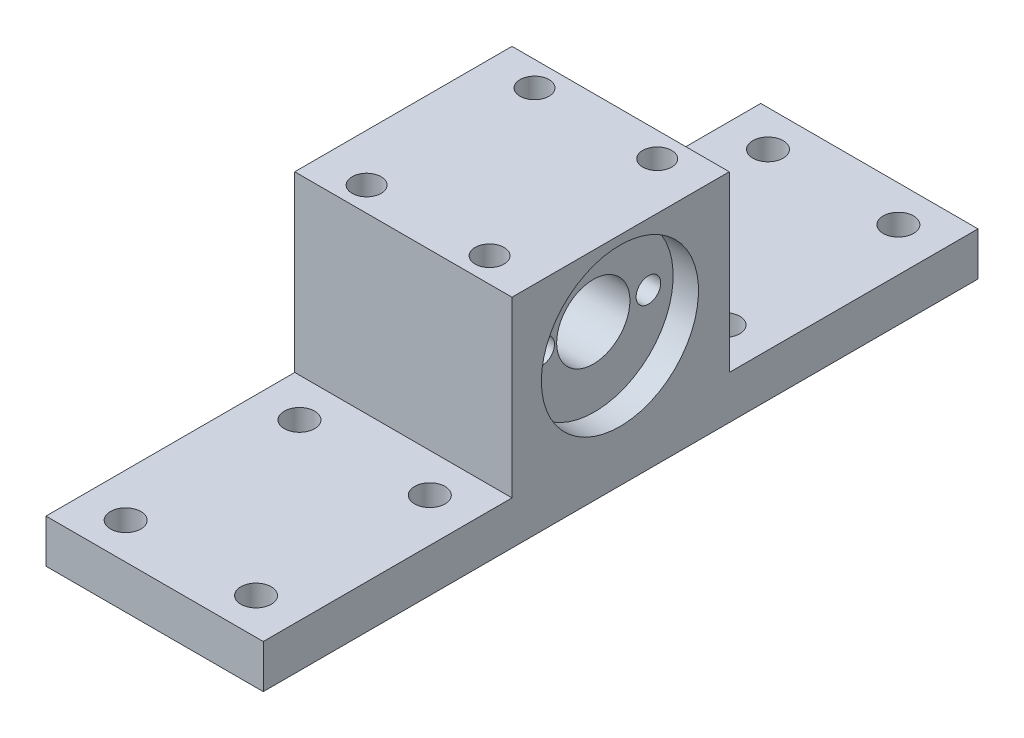
ISO-10303-21;
HEADER;
FILE_DESCRIPTION(('STEP AP214'),'2;1');
FILE_NAME('part.step','',(''),(''),'','','');
FILE_SCHEMA(('AUTOMOTIVE_DESIGN { 1 0 10303 214 1 1 1 1 }'));
ENDSEC;
DATA;
#1=APPLICATION_CONTEXT('core data for automotive mechanical design processes');
#2=APPLICATION_PROTOCOL_DEFINITION('international standard','automotive_design',2000,#1);
#3=PRODUCT_CONTEXT('',#1,'mechanical');
#4=PRODUCT('Part','Part','',(#3));
#5=PRODUCT_RELATED_PRODUCT_CATEGORY('part','',(#4));
#6=PRODUCT_DEFINITION_FORMATION('','',#4);
#7=PRODUCT_DEFINITION_CONTEXT('part definition',#1,'design');
#8=PRODUCT_DEFINITION('design','',#6,#7);
#9=PRODUCT_DEFINITION_SHAPE('','',#8);
#10=(LENGTH_UNIT() NAMED_UNIT(*) SI_UNIT(.MILLI.,.METRE.));
#11=(NAMED_UNIT(*) PLANE_ANGLE_UNIT() SI_UNIT($,.RADIAN.));
#12=(NAMED_UNIT(*) SI_UNIT($,.STERADIAN.) SOLID_ANGLE_UNIT());
#13=UNCERTAINTY_MEASURE_WITH_UNIT(LENGTH_MEASURE(1.E-05),#10,'distance_accuracy_value','');
#14=(GEOMETRIC_REPRESENTATION_CONTEXT(3) GLOBAL_UNCERTAINTY_ASSIGNED_CONTEXT((#13)) GLOBAL_UNIT_ASSIGNED_CONTEXT((#10,
#11,#12)) REPRESENTATION_CONTEXT('',''));
#15=CARTESIAN_POINT('',(0.,0.,0.));
#16=DIRECTION('',(0.,0.,1.));
#17=DIRECTION('',(1.,0.,0.));
#18=AXIS2_PLACEMENT_3D('',#15,#16,#17);
#19=CARTESIAN_POINT('',(30.,8.38775572035806,0.246661601781765));
#20=DIRECTION('',(-1.,0.,0.));
#21=DIRECTION('',(0.,0.,1.));
#22=AXIS2_PLACEMENT_3D('',#19,#20,#21);
#23=CYLINDRICAL_SURFACE('',#22,5.06);
#24=CARTESIAN_POINT('',(26.5,8.38775572035806,0.246661601781765));
#25=DIRECTION('',(1.,0.,0.));
#26=DIRECTION('',(0.,0.,-1.));
#27=AXIS2_PLACEMENT_3D('',#24,#25,#26);
#28=CIRCLE('',#27,5.06);
#29=CARTESIAN_POINT('',(26.5,8.38775572035806,-4.81333839821823));
#30=VERTEX_POINT('',#29);
#31=EDGE_CURVE('E195',#30,#30,#28,.T.);
#32=ORIENTED_EDGE('',*,*,#31,.T.);
#33=EDGE_LOOP('',(#32));
#34=FACE_BOUND('',#33,.T.);
#35=CARTESIAN_POINT('',(3.5,8.38775572035806,0.246661601781765));
#36=DIRECTION('',(-1.,0.,0.));
#37=DIRECTION('',(0.,0.,1.));
#38=AXIS2_PLACEMENT_3D('',#35,#36,#37);
#39=CIRCLE('',#38,5.06);
#40=CARTESIAN_POINT('',(3.5,8.38775572035806,5.30666160178176));
#41=VERTEX_POINT('',#40);
#42=EDGE_CURVE('E398',#41,#41,#39,.T.);
#43=ORIENTED_EDGE('',*,*,#42,.T.);
#44=EDGE_LOOP('',(#43));
#45=FACE_BOUND('',#44,.T.);
#46=ADVANCED_FACE('F43',(#34,#45),#23,.F.);
#47=CARTESIAN_POINT('',(30.,8.38775572035806,7.30666160178176));
#48=DIRECTION('',(-1.,0.,0.));
#49=DIRECTION('',(0.,0.,1.));
#50=AXIS2_PLACEMENT_3D('',#47,#48,#49);
#51=CYLINDRICAL_SURFACE('',#50,1.7);
#52=CARTESIAN_POINT('',(26.5,8.38775572035806,7.30666160178176));
#53=DIRECTION('',(1.,0.,0.));
#54=DIRECTION('',(0.,0.,-1.));
#55=AXIS2_PLACEMENT_3D('',#52,#53,#54);
#56=CIRCLE('',#55,1.7);
#57=CARTESIAN_POINT('',(26.5,8.38775572035806,5.60666160178176));
#58=VERTEX_POINT('',#57);
#59=EDGE_CURVE('E191',#58,#58,#56,.T.);
#60=ORIENTED_EDGE('',*,*,#59,.T.);
#61=EDGE_LOOP('',(#60));
#62=FACE_BOUND('',#61,.T.);
#63=CARTESIAN_POINT('',(3.5,8.38775572035806,7.30666160178176));
#64=DIRECTION('',(-1.,0.,0.));
#65=DIRECTION('',(0.,0.,1.));
#66=AXIS2_PLACEMENT_3D('',#63,#64,#65);
#67=CIRCLE('',#66,1.7);
#68=CARTESIAN_POINT('',(3.5,8.38775572035806,9.00666160178177));
#69=VERTEX_POINT('',#68);
#70=EDGE_CURVE('E396',#69,#69,#67,.T.);
#71=ORIENTED_EDGE('',*,*,#70,.T.);
#72=EDGE_LOOP('',(#71));
#73=FACE_BOUND('',#72,.T.);
#74=ADVANCED_FACE('F45',(#62,#73),#51,.F.);
#75=CARTESIAN_POINT('',(30.,8.38775572035806,-7.3636048463425));
#76=DIRECTION('',(-1.,0.,0.));
#77=DIRECTION('',(0.,0.,1.));
#78=AXIS2_PLACEMENT_3D('',#75,#76,#77);
#79=CYLINDRICAL_SURFACE('',#78,1.7);
#80=CARTESIAN_POINT('',(26.5,8.38775572035806,-7.3636048463425));
#81=DIRECTION('',(1.,0.,0.));
#82=DIRECTION('',(0.,0.,-1.));
#83=AXIS2_PLACEMENT_3D('',#80,#81,#82);
#84=CIRCLE('',#83,1.7);
#85=CARTESIAN_POINT('',(26.5,8.38775572035806,-9.0636048463425));
#86=VERTEX_POINT('',#85);
#87=EDGE_CURVE('E188',#86,#86,#84,.F.);
#88=ORIENTED_EDGE('',*,*,#87,.F.);
#89=EDGE_LOOP('',(#88));
#90=FACE_BOUND('',#89,.T.);
#91=CARTESIAN_POINT('',(3.5,8.38775572035806,-7.3636048463425));
#92=DIRECTION('',(-1.,0.,0.));
#93=DIRECTION('',(0.,0.,1.));
#94=AXIS2_PLACEMENT_3D('',#91,#92,#93);
#95=CIRCLE('',#94,1.7);
#96=CARTESIAN_POINT('',(3.5,8.38775572035806,-5.6636048463425));
#97=VERTEX_POINT('',#96);
#98=EDGE_CURVE('E47',#97,#97,#95,.F.);
#99=ORIENTED_EDGE('',*,*,#98,.F.);
#100=EDGE_LOOP('',(#99));
#101=FACE_BOUND('',#100,.T.);
#102=ADVANCED_FACE('F270',(#90,#101),#79,.F.);
#103=CARTESIAN_POINT('',(30.,20.4377557203581,0.));
#104=DIRECTION('',(0.,1.,0.));
#105=DIRECTION('',(0.,0.,1.));
#106=AXIS2_PLACEMENT_3D('',#103,#104,#105);
#107=PLANE('',#106);
#108=CARTESIAN_POINT('',(6.55109209006945,20.4377557203581,11.5970108437514));
#109=DIRECTION('',(0.,1.,0.));
#110=DIRECTION('',(0.,0.,-1.));
#111=AXIS2_PLACEMENT_3D('',#108,#109,#110);
#112=CIRCLE('',#111,2.);
#113=CARTESIAN_POINT('',(6.55109209006945,20.4377557203581,9.59701084375135));
#114=VERTEX_POINT('',#113);
#115=EDGE_CURVE('E382',#114,#114,#112,.T.);
#116=ORIENTED_EDGE('',*,*,#115,.F.);
#117=EDGE_LOOP('',(#116));
#118=FACE_BOUND('',#117,.T.);
#119=CARTESIAN_POINT('',(23.4929257150994,20.4377557203581,11.5648533822731));
#120=DIRECTION('',(0.,1.,0.));
#121=DIRECTION('',(0.,0.,1.));
#122=AXIS2_PLACEMENT_3D('',#119,#120,#121);
#123=CIRCLE('',#122,2.);
#124=CARTESIAN_POINT('',(23.4929257150994,20.4377557203581,13.5648533822731));
#125=VERTEX_POINT('',#124);
#126=EDGE_CURVE('E374',#125,#125,#123,.T.);
#127=ORIENTED_EDGE('',*,*,#126,.F.);
#128=EDGE_LOOP('',(#127));
#129=FACE_BOUND('',#128,.T.);
#130=CARTESIAN_POINT('',(23.4709320720999,20.4377557203581,-11.6094246229313));
#131=DIRECTION('',(0.,1.,0.));
#132=DIRECTION('',(0.,0.,-1.));
#133=AXIS2_PLACEMENT_3D('',#130,#131,#132);
#134=CIRCLE('',#133,2.);
#135=CARTESIAN_POINT('',(23.4709320720999,20.4377557203581,-13.6094246229313));
#136=VERTEX_POINT('',#135);
#137=EDGE_CURVE('E367',#136,#136,#134,.T.);
#138=ORIENTED_EDGE('',*,*,#137,.F.);
#139=EDGE_LOOP('',(#138));
#140=FACE_BOUND('',#139,.T.);
#141=CARTESIAN_POINT('',(6.52906792790008,20.4377557203581,-11.6094246229313));
#142=DIRECTION('',(0.,1.,0.));
#143=DIRECTION('',(0.,0.,1.));
#144=AXIS2_PLACEMENT_3D('',#141,#142,#143);
#145=CIRCLE('',#144,2.);
#146=CARTESIAN_POINT('',(6.52906792790008,20.4377557203581,-9.60942462293129));
#147=VERTEX_POINT('',#146);
#148=EDGE_CURVE('E369',#147,#147,#145,.T.);
#149=ORIENTED_EDGE('',*,*,#148,.F.);
#150=EDGE_LOOP('',(#149));
#151=FACE_BOUND('',#150,.T.);
#152=DIRECTION('',(0.,0.,-1.));
#153=VECTOR('',#152,1.);
#154=CARTESIAN_POINT('',(0.,20.4377557203581,0.));
#155=LINE('',#154,#153);
#156=CARTESIAN_POINT('',(0.,20.4377557203581,14.9715283777196));
#157=VERTEX_POINT('',#156);
#158=CARTESIAN_POINT('',(0.,20.4377557203581,-15.0284716222804));
#159=VERTEX_POINT('',#158);
#160=EDGE_CURVE('E141',#157,#159,#155,.T.);
#161=ORIENTED_EDGE('',*,*,#160,.F.);
#162=DIRECTION('',(-1.,0.,0.));
#163=VECTOR('',#162,1.);
#164=CARTESIAN_POINT('',(30.,20.4377557203581,14.9715283777196));
#165=LINE('',#164,#163);
#166=CARTESIAN_POINT('',(30.,20.4377557203581,14.9715283777196));
#167=VERTEX_POINT('',#166);
#168=EDGE_CURVE('E11',#167,#157,#165,.T.);
#169=ORIENTED_EDGE('',*,*,#168,.F.);
#170=DIRECTION('',(0.,0.,-1.));
#171=VECTOR('',#170,1.);
#172=CARTESIAN_POINT('',(30.,20.4377557203581,0.));
#173=LINE('',#172,#171);
#174=CARTESIAN_POINT('',(30.,20.4377557203581,-15.0284716222804));
#175=VERTEX_POINT('',#174);
#176=EDGE_CURVE('E162',#167,#175,#173,.T.);
#177=ORIENTED_EDGE('',*,*,#176,.T.);
#178=DIRECTION('',(-1.,0.,0.));
#179=VECTOR('',#178,1.);
#180=CARTESIAN_POINT('',(30.,20.4377557203581,-15.0284716222804));
#181=LINE('',#180,#179);
#182=EDGE_CURVE('E62',#175,#159,#181,.T.);
#183=ORIENTED_EDGE('',*,*,#182,.T.);
#184=EDGE_LOOP('',(#161,#169,#177,#183));
#185=FACE_BOUND('',#184,.T.);
#186=ADVANCED_FACE('F275',(#118,#129,#140,#151,#185),#107,.T.);
#187=CARTESIAN_POINT('',(30.,0.,14.9715283777196));
#188=DIRECTION('',(0.,0.,-1.));
#189=DIRECTION('',(0.,1.,0.));
#190=AXIS2_PLACEMENT_3D('',#187,#188,#189);
#191=PLANE('',#190);
#192=DIRECTION('',(0.,-1.,0.));
#193=VECTOR('',#192,1.);
#194=CARTESIAN_POINT('',(0.,0.,14.9715283777196));
#195=LINE('',#194,#193);
#196=CARTESIAN_POINT('',(0.,-3.56224427964192,14.9715283777196));
#197=VERTEX_POINT('',#196);
#198=EDGE_CURVE('E143',#157,#197,#195,.T.);
#199=ORIENTED_EDGE('',*,*,#198,.T.);
#200=DIRECTION('',(-1.,0.,0.));
#201=VECTOR('',#200,1.);
#202=CARTESIAN_POINT('',(30.,-3.56224427964192,14.9715283777196));
#203=LINE('',#202,#201);
#204=CARTESIAN_POINT('',(30.,-3.56224427964192,14.9715283777196));
#205=VERTEX_POINT('',#204);
#206=EDGE_CURVE('E53',#205,#197,#203,.T.);
#207=ORIENTED_EDGE('',*,*,#206,.F.);
#208=DIRECTION('',(0.,-1.,0.));
#209=VECTOR('',#208,1.);
#210=CARTESIAN_POINT('',(30.,0.,14.9715283777196));
#211=LINE('',#210,#209);
#212=EDGE_CURVE('E238',#167,#205,#211,.T.);
#213=ORIENTED_EDGE('',*,*,#212,.F.);
#214=ORIENTED_EDGE('',*,*,#168,.T.);
#215=EDGE_LOOP('',(#199,#207,#213,#214));
#216=FACE_BOUND('',#215,.T.);
#217=ADVANCED_FACE('F421',(#216),#191,.F.);
#218=CARTESIAN_POINT('',(30.,-3.56224427964192,0.));
#219=DIRECTION('',(0.,1.,0.));
#220=DIRECTION('',(0.,0.,1.));
#221=AXIS2_PLACEMENT_3D('',#218,#219,#220);
#222=PLANE('',#221);
#223=CARTESIAN_POINT('',(24.,-3.56224427964192,20.3185283777196));
#224=DIRECTION('',(0.,1.,0.));
#225=DIRECTION('',(0.,0.,1.));
#226=AXIS2_PLACEMENT_3D('',#223,#224,#225);
#227=CIRCLE('',#226,2.1);
#228=CARTESIAN_POINT('',(24.,-3.56224427964192,22.4185283777196));
#229=VERTEX_POINT('',#228);
#230=EDGE_CURVE('E144',#229,#229,#227,.T.);
#231=ORIENTED_EDGE('',*,*,#230,.F.);
#232=EDGE_LOOP('',(#231));
#233=FACE_BOUND('',#232,.T.);
#234=CARTESIAN_POINT('',(24.,-3.56224427964192,44.3185283777196));
#235=DIRECTION('',(0.,1.,0.));
#236=DIRECTION('',(0.,0.,1.));
#237=AXIS2_PLACEMENT_3D('',#234,#235,#236);
#238=CIRCLE('',#237,2.1);
#239=CARTESIAN_POINT('',(24.,-3.56224427964192,46.4185283777196));
#240=VERTEX_POINT('',#239);
#241=EDGE_CURVE('E232',#240,#240,#238,.T.);
#242=ORIENTED_EDGE('',*,*,#241,.F.);
#243=EDGE_LOOP('',(#242));
#244=FACE_BOUND('',#243,.T.);
#245=CARTESIAN_POINT('',(5.99999999999998,-3.56224427964192,44.3185283777196));
#246=DIRECTION('',(0.,1.,0.));
#247=DIRECTION('',(0.,0.,1.));
#248=AXIS2_PLACEMENT_3D('',#245,#246,#247);
#249=CIRCLE('',#248,2.1);
#250=CARTESIAN_POINT('',(5.99999999999998,-3.56224427964192,46.4185283777196));
#251=VERTEX_POINT('',#250);
#252=EDGE_CURVE('E229',#251,#251,#249,.T.);
#253=ORIENTED_EDGE('',*,*,#252,.F.);
#254=EDGE_LOOP('',(#253));
#255=FACE_BOUND('',#254,.T.);
#256=CARTESIAN_POINT('',(5.99999999999997,-3.56224427964192,20.3185283777196));
#257=DIRECTION('',(0.,1.,0.));
#258=DIRECTION('',(0.,0.,1.));
#259=AXIS2_PLACEMENT_3D('',#256,#257,#258);
#260=CIRCLE('',#259,2.1);
#261=CARTESIAN_POINT('',(5.99999999999997,-3.56224427964192,22.4185283777196));
#262=VERTEX_POINT('',#261);
#263=EDGE_CURVE('E185',#262,#262,#260,.T.);
#264=ORIENTED_EDGE('',*,*,#263,.F.);
#265=EDGE_LOOP('',(#264));
#266=FACE_BOUND('',#265,.T.);
#267=DIRECTION('',(0.,0.,-1.));
#268=VECTOR('',#267,1.);
#269=CARTESIAN_POINT('',(0.,-3.56224427964192,0.));
#270=LINE('',#269,#268);
#271=CARTESIAN_POINT('',(0.,-3.56224427964192,49.3185283777196));
#272=VERTEX_POINT('',#271);
#273=EDGE_CURVE('E147',#272,#197,#270,.T.);
#274=ORIENTED_EDGE('',*,*,#273,.F.);
#275=DIRECTION('',(-1.,0.,0.));
#276=VECTOR('',#275,1.);
#277=CARTESIAN_POINT('',(30.,-3.56224427964192,49.3185283777196));
#278=LINE('',#277,#276);
#279=CARTESIAN_POINT('',(30.,-3.56224427964192,49.3185283777196));
#280=VERTEX_POINT('',#279);
#281=EDGE_CURVE('E169',#280,#272,#278,.T.);
#282=ORIENTED_EDGE('',*,*,#281,.F.);
#283=DIRECTION('',(0.,0.,-1.));
#284=VECTOR('',#283,1.);
#285=CARTESIAN_POINT('',(30.,-3.56224427964192,0.));
#286=LINE('',#285,#284);
#287=EDGE_CURVE('E240',#280,#205,#286,.T.);
#288=ORIENTED_EDGE('',*,*,#287,.T.);
#289=ORIENTED_EDGE('',*,*,#206,.T.);
#290=EDGE_LOOP('',(#274,#282,#288,#289));
#291=FACE_BOUND('',#290,.T.);
#292=ADVANCED_FACE('F426',(#233,#244,#255,#266,#291),#222,.T.);
#293=CARTESIAN_POINT('',(30.,0.,49.3185283777196));
#294=DIRECTION('',(0.,0.,-1.));
#295=DIRECTION('',(-1.,0.,0.));
#296=AXIS2_PLACEMENT_3D('',#293,#294,#295);
#297=PLANE('',#296);
#298=DIRECTION('',(0.,-1.,0.));
#299=VECTOR('',#298,1.);
#300=CARTESIAN_POINT('',(0.,0.,49.3185283777196));
#301=LINE('',#300,#299);
#302=CARTESIAN_POINT('',(0.,-9.56224427964194,49.3185283777196));
#303=VERTEX_POINT('',#302);
#304=EDGE_CURVE('E150',#272,#303,#301,.T.);
#305=ORIENTED_EDGE('',*,*,#304,.T.);
#306=DIRECTION('',(-1.,0.,0.));
#307=VECTOR('',#306,1.);
#308=CARTESIAN_POINT('',(30.,-9.56224427964194,49.3185283777196));
#309=LINE('',#308,#307);
#310=CARTESIAN_POINT('',(30.,-9.56224427964194,49.3185283777196));
#311=VERTEX_POINT('',#310);
#312=EDGE_CURVE('E166',#311,#303,#309,.T.);
#313=ORIENTED_EDGE('',*,*,#312,.F.);
#314=DIRECTION('',(0.,-1.,0.));
#315=VECTOR('',#314,1.);
#316=CARTESIAN_POINT('',(30.,0.,49.3185283777196));
#317=LINE('',#316,#315);
#318=EDGE_CURVE('E136',#280,#311,#317,.T.);
#319=ORIENTED_EDGE('',*,*,#318,.F.);
#320=ORIENTED_EDGE('',*,*,#281,.T.);
#321=EDGE_LOOP('',(#305,#313,#319,#320));
#322=FACE_BOUND('',#321,.T.);
#323=ADVANCED_FACE('F246',(#322),#297,.F.);
#324=CARTESIAN_POINT('',(30.,-9.56224427964193,0.));
#325=DIRECTION('',(0.,1.,0.));
#326=DIRECTION('',(0.,0.,1.));
#327=AXIS2_PLACEMENT_3D('',#324,#325,#326);
#328=PLANE('',#327);
#329=CARTESIAN_POINT('',(24.,-9.56224427964194,20.3185283777196));
#330=DIRECTION('',(0.,1.,0.));
#331=DIRECTION('',(0.,0.,1.));
#332=AXIS2_PLACEMENT_3D('',#329,#330,#331);
#333=CIRCLE('',#332,2.1);
#334=CARTESIAN_POINT('',(24.,-9.56224427964194,22.4185283777196));
#335=VERTEX_POINT('',#334);
#336=EDGE_CURVE('E214',#335,#335,#333,.T.);
#337=ORIENTED_EDGE('',*,*,#336,.T.);
#338=EDGE_LOOP('',(#337));
#339=FACE_BOUND('',#338,.T.);
#340=CARTESIAN_POINT('',(24.,-9.56224427964194,44.3185283777196));
#341=DIRECTION('',(0.,1.,0.));
#342=DIRECTION('',(0.,0.,1.));
#343=AXIS2_PLACEMENT_3D('',#340,#341,#342);
#344=CIRCLE('',#343,2.1);
#345=CARTESIAN_POINT('',(24.,-9.56224427964194,46.4185283777196));
#346=VERTEX_POINT('',#345);
#347=EDGE_CURVE('E217',#346,#346,#344,.T.);
#348=ORIENTED_EDGE('',*,*,#347,.T.);
#349=EDGE_LOOP('',(#348));
#350=FACE_BOUND('',#349,.T.);
#351=CARTESIAN_POINT('',(5.99999999999998,-9.56224427964194,44.3185283777196));
#352=DIRECTION('',(0.,1.,0.));
#353=DIRECTION('',(0.,0.,1.));
#354=AXIS2_PLACEMENT_3D('',#351,#352,#353);
#355=CIRCLE('',#354,2.1);
#356=CARTESIAN_POINT('',(5.99999999999998,-9.56224427964194,46.4185283777196));
#357=VERTEX_POINT('',#356);
#358=EDGE_CURVE('E220',#357,#357,#355,.T.);
#359=ORIENTED_EDGE('',*,*,#358,.T.);
#360=EDGE_LOOP('',(#359));
#361=FACE_BOUND('',#360,.T.);
#362=CARTESIAN_POINT('',(5.99999999999997,-9.56224427964194,-44.3754716222804));
#363=DIRECTION('',(0.,1.,0.));
#364=DIRECTION('',(0.,0.,-1.));
#365=AXIS2_PLACEMENT_3D('',#362,#363,#364);
#366=CIRCLE('',#365,2.1);
#367=CARTESIAN_POINT('',(5.99999999999997,-9.56224427964194,-46.4754716222804));
#368=VERTEX_POINT('',#367);
#369=EDGE_CURVE('E208',#368,#368,#366,.T.);
#370=ORIENTED_EDGE('',*,*,#369,.T.);
#371=EDGE_LOOP('',(#370));
#372=FACE_BOUND('',#371,.T.);
#373=CARTESIAN_POINT('',(24.,-9.56224427964194,-44.3754716222803));
#374=DIRECTION('',(0.,1.,0.));
#375=DIRECTION('',(0.,0.,-1.));
#376=AXIS2_PLACEMENT_3D('',#373,#374,#375);
#377=CIRCLE('',#376,2.1);
#378=CARTESIAN_POINT('',(24.,-9.56224427964194,-46.4754716222803));
#379=VERTEX_POINT('',#378);
#380=EDGE_CURVE('E205',#379,#379,#377,.T.);
#381=ORIENTED_EDGE('',*,*,#380,.T.);
#382=EDGE_LOOP('',(#381));
#383=FACE_BOUND('',#382,.T.);
#384=CARTESIAN_POINT('',(24.,-9.56224427964194,-20.3754716222804));
#385=DIRECTION('',(0.,1.,0.));
#386=DIRECTION('',(0.,0.,-1.));
#387=AXIS2_PLACEMENT_3D('',#384,#385,#386);
#388=CIRCLE('',#387,2.1);
#389=CARTESIAN_POINT('',(24.,-9.56224427964194,-22.4754716222804));
#390=VERTEX_POINT('',#389);
#391=EDGE_CURVE('E209',#390,#390,#388,.T.);
#392=ORIENTED_EDGE('',*,*,#391,.T.);
#393=EDGE_LOOP('',(#392));
#394=FACE_BOUND('',#393,.T.);
#395=CARTESIAN_POINT('',(5.99999999999997,-9.56224427964194,-20.3754716222804));
#396=DIRECTION('',(0.,1.,0.));
#397=DIRECTION('',(0.,0.,-1.));
#398=AXIS2_PLACEMENT_3D('',#395,#396,#397);
#399=CIRCLE('',#398,2.1);
#400=CARTESIAN_POINT('',(5.99999999999997,-9.56224427964194,-22.4754716222804));
#401=VERTEX_POINT('',#400);
#402=EDGE_CURVE('E200',#401,#401,#399,.T.);
#403=ORIENTED_EDGE('',*,*,#402,.T.);
#404=EDGE_LOOP('',(#403));
#405=FACE_BOUND('',#404,.T.);
#406=CARTESIAN_POINT('',(5.99999999999997,-9.56224427964194,20.3185283777196));
#407=DIRECTION('',(0.,1.,0.));
#408=DIRECTION('',(0.,0.,1.));
#409=AXIS2_PLACEMENT_3D('',#406,#407,#408);
#410=CIRCLE('',#409,2.1);
#411=CARTESIAN_POINT('',(5.99999999999997,-9.56224427964194,22.4185283777196));
#412=VERTEX_POINT('',#411);
#413=EDGE_CURVE('E176',#412,#412,#410,.T.);
#414=ORIENTED_EDGE('',*,*,#413,.T.);
#415=EDGE_LOOP('',(#414));
#416=FACE_BOUND('',#415,.T.);
#417=DIRECTION('',(0.,0.,-1.));
#418=VECTOR('',#417,1.);
#419=CARTESIAN_POINT('',(0.,-9.56224427964193,0.));
#420=LINE('',#419,#418);
#421=CARTESIAN_POINT('',(0.,-9.56224427964192,-49.3754716222804));
#422=VERTEX_POINT('',#421);
#423=EDGE_CURVE('E153',#303,#422,#420,.T.);
#424=ORIENTED_EDGE('',*,*,#423,.T.);
#425=DIRECTION('',(-1.,0.,0.));
#426=VECTOR('',#425,1.);
#427=CARTESIAN_POINT('',(30.,-9.56224427964192,-49.3754716222804));
#428=LINE('',#427,#426);
#429=CARTESIAN_POINT('',(30.,-9.56224427964192,-49.3754716222804));
#430=VERTEX_POINT('',#429);
#431=EDGE_CURVE('E122',#430,#422,#428,.T.);
#432=ORIENTED_EDGE('',*,*,#431,.F.);
#433=DIRECTION('',(0.,0.,-1.));
#434=VECTOR('',#433,1.);
#435=CARTESIAN_POINT('',(30.,-9.56224427964193,0.));
#436=LINE('',#435,#434);
#437=EDGE_CURVE('E133',#311,#430,#436,.T.);
#438=ORIENTED_EDGE('',*,*,#437,.F.);
#439=ORIENTED_EDGE('',*,*,#312,.T.);
#440=EDGE_LOOP('',(#424,#432,#438,#439));
#441=FACE_BOUND('',#440,.T.);
#442=ADVANCED_FACE('F249',(#339,#350,#361,#372,#383,#394,#405,#416,#441),#328,.F.);
#443=CARTESIAN_POINT('',(30.,0.,-49.3754716222804));
#444=DIRECTION('',(0.,0.,-1.));
#445=DIRECTION('',(-1.,0.,0.));
#446=AXIS2_PLACEMENT_3D('',#443,#444,#445);
#447=PLANE('',#446);
#448=DIRECTION('',(0.,-1.,0.));
#449=VECTOR('',#448,1.);
#450=CARTESIAN_POINT('',(0.,0.,-49.3754716222804));
#451=LINE('',#450,#449);
#452=CARTESIAN_POINT('',(0.,-3.56224427964191,-49.3754716222804));
#453=VERTEX_POINT('',#452);
#454=EDGE_CURVE('E119',#453,#422,#451,.T.);
#455=ORIENTED_EDGE('',*,*,#454,.F.);
#456=DIRECTION('',(-1.,0.,0.));
#457=VECTOR('',#456,1.);
#458=CARTESIAN_POINT('',(30.,-3.56224427964191,-49.3754716222804));
#459=LINE('',#458,#457);
#460=CARTESIAN_POINT('',(30.,-3.56224427964191,-49.3754716222804));
#461=VERTEX_POINT('',#460);
#462=EDGE_CURVE('E113',#461,#453,#459,.T.);
#463=ORIENTED_EDGE('',*,*,#462,.F.);
#464=DIRECTION('',(0.,-1.,0.));
#465=VECTOR('',#464,1.);
#466=CARTESIAN_POINT('',(30.,0.,-49.3754716222804));
#467=LINE('',#466,#465);
#468=EDGE_CURVE('E117',#461,#430,#467,.T.);
#469=ORIENTED_EDGE('',*,*,#468,.T.);
#470=ORIENTED_EDGE('',*,*,#431,.T.);
#471=EDGE_LOOP('',(#455,#463,#469,#470));
#472=FACE_BOUND('',#471,.T.);
#473=ADVANCED_FACE('F115',(#472),#447,.T.);
#474=CARTESIAN_POINT('',(30.,-3.56224427964193,0.));
#475=DIRECTION('',(0.,-1.,0.));
#476=DIRECTION('',(0.,0.,-1.));
#477=AXIS2_PLACEMENT_3D('',#474,#475,#476);
#478=PLANE('',#477);
#479=CARTESIAN_POINT('',(5.99999999999997,-3.56224427964191,-44.3754716222804));
#480=DIRECTION('',(0.,-1.,0.));
#481=DIRECTION('',(0.,0.,-1.));
#482=AXIS2_PLACEMENT_3D('',#479,#480,#481);
#483=CIRCLE('',#482,2.1);
#484=CARTESIAN_POINT('',(5.99999999999997,-3.56224427964191,-46.4754716222804));
#485=VERTEX_POINT('',#484);
#486=EDGE_CURVE('E182',#485,#485,#483,.T.);
#487=ORIENTED_EDGE('',*,*,#486,.T.);
#488=EDGE_LOOP('',(#487));
#489=FACE_BOUND('',#488,.T.);
#490=CARTESIAN_POINT('',(24.,-3.56224427964191,-44.3754716222803));
#491=DIRECTION('',(0.,-1.,0.));
#492=DIRECTION('',(0.,0.,-1.));
#493=AXIS2_PLACEMENT_3D('',#490,#491,#492);
#494=CIRCLE('',#493,2.1);
#495=CARTESIAN_POINT('',(24.,-3.56224427964191,-46.4754716222803));
#496=VERTEX_POINT('',#495);
#497=EDGE_CURVE('E179',#496,#496,#494,.T.);
#498=ORIENTED_EDGE('',*,*,#497,.T.);
#499=EDGE_LOOP('',(#498));
#500=FACE_BOUND('',#499,.T.);
#501=CARTESIAN_POINT('',(24.,-3.56224427964192,-20.3754716222804));
#502=DIRECTION('',(0.,-1.,0.));
#503=DIRECTION('',(0.,0.,-1.));
#504=AXIS2_PLACEMENT_3D('',#501,#502,#503);
#505=CIRCLE('',#504,2.1);
#506=CARTESIAN_POINT('',(24.,-3.56224427964192,-22.4754716222804));
#507=VERTEX_POINT('',#506);
#508=EDGE_CURVE('E175',#507,#507,#505,.T.);
#509=ORIENTED_EDGE('',*,*,#508,.T.);
#510=EDGE_LOOP('',(#509));
#511=FACE_BOUND('',#510,.T.);
#512=CARTESIAN_POINT('',(5.99999999999997,-3.56224427964192,-20.3754716222804));
#513=DIRECTION('',(0.,-1.,0.));
#514=DIRECTION('',(0.,0.,-1.));
#515=AXIS2_PLACEMENT_3D('',#512,#513,#514);
#516=CIRCLE('',#515,2.1);
#517=CARTESIAN_POINT('',(5.99999999999997,-3.56224427964192,-22.4754716222804));
#518=VERTEX_POINT('',#517);
#519=EDGE_CURVE('E172',#518,#518,#516,.T.);
#520=ORIENTED_EDGE('',*,*,#519,.T.);
#521=EDGE_LOOP('',(#520));
#522=FACE_BOUND('',#521,.T.);
#523=DIRECTION('',(0.,0.,1.));
#524=VECTOR('',#523,1.);
#525=CARTESIAN_POINT('',(0.,-3.56224427964193,0.));
#526=LINE('',#525,#524);
#527=CARTESIAN_POINT('',(0.,-3.56224427964192,-15.0284716222804));
#528=VERTEX_POINT('',#527);
#529=EDGE_CURVE('E157',#453,#528,#526,.T.);
#530=ORIENTED_EDGE('',*,*,#529,.T.);
#531=DIRECTION('',(-1.,0.,0.));
#532=VECTOR('',#531,1.);
#533=CARTESIAN_POINT('',(30.,-3.56224427964192,-15.0284716222804));
#534=LINE('',#533,#532);
#535=CARTESIAN_POINT('',(30.,-3.56224427964192,-15.0284716222804));
#536=VERTEX_POINT('',#535);
#537=EDGE_CURVE('E88',#536,#528,#534,.T.);
#538=ORIENTED_EDGE('',*,*,#537,.F.);
#539=DIRECTION('',(0.,0.,1.));
#540=VECTOR('',#539,1.);
#541=CARTESIAN_POINT('',(30.,-3.56224427964193,0.));
#542=LINE('',#541,#540);
#543=EDGE_CURVE('E124',#461,#536,#542,.T.);
#544=ORIENTED_EDGE('',*,*,#543,.F.);
#545=ORIENTED_EDGE('',*,*,#462,.T.);
#546=EDGE_LOOP('',(#530,#538,#544,#545));
#547=FACE_BOUND('',#546,.T.);
#548=ADVANCED_FACE('F125',(#489,#500,#511,#522,#547),#478,.F.);
#549=CARTESIAN_POINT('',(30.,0.,-15.0284716222804));
#550=DIRECTION('',(0.,0.,-1.));
#551=DIRECTION('',(0.,1.,0.));
#552=AXIS2_PLACEMENT_3D('',#549,#550,#551);
#553=PLANE('',#552);
#554=DIRECTION('',(0.,-1.,0.));
#555=VECTOR('',#554,1.);
#556=CARTESIAN_POINT('',(0.,0.,-15.0284716222804));
#557=LINE('',#556,#555);
#558=EDGE_CURVE('E159',#159,#528,#557,.T.);
#559=ORIENTED_EDGE('',*,*,#558,.F.);
#560=ORIENTED_EDGE('',*,*,#182,.F.);
#561=DIRECTION('',(0.,-1.,0.));
#562=VECTOR('',#561,1.);
#563=CARTESIAN_POINT('',(30.,0.,-15.0284716222804));
#564=LINE('',#563,#562);
#565=EDGE_CURVE('E128',#175,#536,#564,.T.);
#566=ORIENTED_EDGE('',*,*,#565,.T.);
#567=ORIENTED_EDGE('',*,*,#537,.T.);
#568=EDGE_LOOP('',(#559,#560,#566,#567));
#569=FACE_BOUND('',#568,.T.);
#570=ADVANCED_FACE('F253',(#569),#553,.T.);
#571=CARTESIAN_POINT('',(30.,0.,0.));
#572=DIRECTION('',(1.,0.,0.));
#573=DIRECTION('',(0.,0.,-1.));
#574=AXIS2_PLACEMENT_3D('',#571,#572,#573);
#575=PLANE('',#574);
#576=CARTESIAN_POINT('',(30.,8.36510634571228,0.0679193361325103));
#577=DIRECTION('',(1.,0.,0.));
#578=DIRECTION('',(0.,0.,-1.));
#579=AXIS2_PLACEMENT_3D('',#576,#577,#578);
#580=CIRCLE('',#579,10.8499999999997);
#581=CARTESIAN_POINT('',(30.,8.36510634571228,10.9179193361322));
#582=VERTEX_POINT('',#581);
#583=EDGE_CURVE('E186',#582,#582,#580,.F.);
#584=ORIENTED_EDGE('',*,*,#583,.T.);
#585=EDGE_LOOP('',(#584));
#586=FACE_BOUND('',#585,.T.);
#587=ORIENTED_EDGE('',*,*,#176,.F.);
#588=ORIENTED_EDGE('',*,*,#212,.T.);
#589=ORIENTED_EDGE('',*,*,#287,.F.);
#590=ORIENTED_EDGE('',*,*,#318,.T.);
#591=ORIENTED_EDGE('',*,*,#437,.T.);
#592=ORIENTED_EDGE('',*,*,#468,.F.);
#593=ORIENTED_EDGE('',*,*,#543,.T.);
#594=ORIENTED_EDGE('',*,*,#565,.F.);
#595=EDGE_LOOP('',(#587,#588,#589,#590,#591,#592,#593,#594));
#596=FACE_BOUND('',#595,.T.);
#597=ADVANCED_FACE('F131',(#586,#596),#575,.T.);
#598=CARTESIAN_POINT('',(0.,0.,0.));
#599=DIRECTION('',(1.,0.,0.));
#600=DIRECTION('',(0.,0.,-1.));
#601=AXIS2_PLACEMENT_3D('',#598,#599,#600);
#602=PLANE('',#601);
#603=CARTESIAN_POINT('',(0.,8.38775572035815,0.246661601781516));
#604=DIRECTION('',(-1.,0.,0.));
#605=DIRECTION('',(0.,0.,1.));
#606=AXIS2_PLACEMENT_3D('',#603,#604,#605);
#607=CIRCLE('',#606,10.8500000000002);
#608=CARTESIAN_POINT('',(0.,8.38775572035815,11.0966616017817));
#609=VERTEX_POINT('',#608);
#610=EDGE_CURVE('E389',#609,#609,#607,.T.);
#611=ORIENTED_EDGE('',*,*,#610,.F.);
#612=EDGE_LOOP('',(#611));
#613=FACE_BOUND('',#612,.T.);
#614=ORIENTED_EDGE('',*,*,#160,.T.);
#615=ORIENTED_EDGE('',*,*,#558,.T.);
#616=ORIENTED_EDGE('',*,*,#529,.F.);
#617=ORIENTED_EDGE('',*,*,#454,.T.);
#618=ORIENTED_EDGE('',*,*,#423,.F.);
#619=ORIENTED_EDGE('',*,*,#304,.F.);
#620=ORIENTED_EDGE('',*,*,#273,.T.);
#621=ORIENTED_EDGE('',*,*,#198,.F.);
#622=EDGE_LOOP('',(#614,#615,#616,#617,#618,#619,#620,#621));
#623=FACE_BOUND('',#622,.T.);
#624=ADVANCED_FACE('F251',(#613,#623),#602,.F.);
#625=CARTESIAN_POINT('',(5.99999999999997,-9.56224427964194,-20.3754716222804));
#626=DIRECTION('',(0.,1.,0.));
#627=DIRECTION('',(0.,0.,1.));
#628=AXIS2_PLACEMENT_3D('',#625,#626,#627);
#629=CYLINDRICAL_SURFACE('',#628,2.1);
#630=ORIENTED_EDGE('',*,*,#402,.F.);
#631=EDGE_LOOP('',(#630));
#632=FACE_BOUND('',#631,.T.);
#633=ORIENTED_EDGE('',*,*,#519,.F.);
#634=EDGE_LOOP('',(#633));
#635=FACE_BOUND('',#634,.T.);
#636=ADVANCED_FACE('F278',(#632,#635),#629,.F.);
#637=CARTESIAN_POINT('',(24.,-9.56224427964194,-20.3754716222804));
#638=DIRECTION('',(0.,1.,0.));
#639=DIRECTION('',(0.,0.,1.));
#640=AXIS2_PLACEMENT_3D('',#637,#638,#639);
#641=CYLINDRICAL_SURFACE('',#640,2.1);
#642=ORIENTED_EDGE('',*,*,#391,.F.);
#643=EDGE_LOOP('',(#642));
#644=FACE_BOUND('',#643,.T.);
#645=ORIENTED_EDGE('',*,*,#508,.F.);
#646=EDGE_LOOP('',(#645));
#647=FACE_BOUND('',#646,.T.);
#648=ADVANCED_FACE('F305',(#644,#647),#641,.F.);
#649=CARTESIAN_POINT('',(24.,-9.56224427964194,-44.3754716222803));
#650=DIRECTION('',(0.,1.,0.));
#651=DIRECTION('',(0.,0.,1.));
#652=AXIS2_PLACEMENT_3D('',#649,#650,#651);
#653=CYLINDRICAL_SURFACE('',#652,2.1);
#654=ORIENTED_EDGE('',*,*,#380,.F.);
#655=EDGE_LOOP('',(#654));
#656=FACE_BOUND('',#655,.T.);
#657=ORIENTED_EDGE('',*,*,#497,.F.);
#658=EDGE_LOOP('',(#657));
#659=FACE_BOUND('',#658,.T.);
#660=ADVANCED_FACE('F289',(#656,#659),#653,.F.);
#661=CARTESIAN_POINT('',(5.99999999999997,-9.56224427964194,-44.3754716222804));
#662=DIRECTION('',(0.,1.,0.));
#663=DIRECTION('',(0.,0.,1.));
#664=AXIS2_PLACEMENT_3D('',#661,#662,#663);
#665=CYLINDRICAL_SURFACE('',#664,2.1);
#666=ORIENTED_EDGE('',*,*,#369,.F.);
#667=EDGE_LOOP('',(#666));
#668=FACE_BOUND('',#667,.T.);
#669=ORIENTED_EDGE('',*,*,#486,.F.);
#670=EDGE_LOOP('',(#669));
#671=FACE_BOUND('',#670,.T.);
#672=ADVANCED_FACE('F285',(#668,#671),#665,.F.);
#673=CARTESIAN_POINT('',(5.99999999999997,-9.56224427964194,20.3185283777196));
#674=DIRECTION('',(0.,1.,0.));
#675=DIRECTION('',(0.,0.,1.));
#676=AXIS2_PLACEMENT_3D('',#673,#674,#675);
#677=CYLINDRICAL_SURFACE('',#676,2.1);
#678=ORIENTED_EDGE('',*,*,#263,.T.);
#679=EDGE_LOOP('',(#678));
#680=FACE_BOUND('',#679,.T.);
#681=ORIENTED_EDGE('',*,*,#413,.F.);
#682=EDGE_LOOP('',(#681));
#683=FACE_BOUND('',#682,.T.);
#684=ADVANCED_FACE('F281',(#680,#683),#677,.F.);
#685=CARTESIAN_POINT('',(5.99999999999998,-9.56224427964194,44.3185283777196));
#686=DIRECTION('',(0.,1.,0.));
#687=DIRECTION('',(0.,0.,1.));
#688=AXIS2_PLACEMENT_3D('',#685,#686,#687);
#689=CYLINDRICAL_SURFACE('',#688,2.1);
#690=ORIENTED_EDGE('',*,*,#252,.T.);
#691=EDGE_LOOP('',(#690));
#692=FACE_BOUND('',#691,.T.);
#693=ORIENTED_EDGE('',*,*,#358,.F.);
#694=EDGE_LOOP('',(#693));
#695=FACE_BOUND('',#694,.T.);
#696=ADVANCED_FACE('F284',(#692,#695),#689,.F.);
#697=CARTESIAN_POINT('',(24.,-9.56224427964194,44.3185283777196));
#698=DIRECTION('',(0.,1.,0.));
#699=DIRECTION('',(0.,0.,1.));
#700=AXIS2_PLACEMENT_3D('',#697,#698,#699);
#701=CYLINDRICAL_SURFACE('',#700,2.1);
#702=ORIENTED_EDGE('',*,*,#241,.T.);
#703=EDGE_LOOP('',(#702));
#704=FACE_BOUND('',#703,.T.);
#705=ORIENTED_EDGE('',*,*,#347,.F.);
#706=EDGE_LOOP('',(#705));
#707=FACE_BOUND('',#706,.T.);
#708=ADVANCED_FACE('F293',(#704,#707),#701,.F.);
#709=CARTESIAN_POINT('',(24.,-9.56224427964194,20.3185283777196));
#710=DIRECTION('',(0.,1.,0.));
#711=DIRECTION('',(0.,0.,1.));
#712=AXIS2_PLACEMENT_3D('',#709,#710,#711);
#713=CYLINDRICAL_SURFACE('',#712,2.1);
#714=ORIENTED_EDGE('',*,*,#230,.T.);
#715=EDGE_LOOP('',(#714));
#716=FACE_BOUND('',#715,.T.);
#717=ORIENTED_EDGE('',*,*,#336,.F.);
#718=EDGE_LOOP('',(#717));
#719=FACE_BOUND('',#718,.T.);
#720=ADVANCED_FACE('F297',(#716,#719),#713,.F.);
#721=CARTESIAN_POINT('',(26.5,8.36510634571228,0.0679193361325103));
#722=DIRECTION('',(1.,0.,0.));
#723=DIRECTION('',(0.,0.,-1.));
#724=AXIS2_PLACEMENT_3D('',#721,#722,#723);
#725=PLANE('',#724);
#726=ORIENTED_EDGE('',*,*,#31,.F.);
#727=EDGE_LOOP('',(#726));
#728=FACE_BOUND('',#727,.T.);
#729=ORIENTED_EDGE('',*,*,#59,.F.);
#730=EDGE_LOOP('',(#729));
#731=FACE_BOUND('',#730,.T.);
#732=CARTESIAN_POINT('',(26.5,8.36510634571228,0.0679193361325103));
#733=DIRECTION('',(1.,0.,0.));
#734=DIRECTION('',(0.,0.,-1.));
#735=AXIS2_PLACEMENT_3D('',#732,#733,#734);
#736=CIRCLE('',#735,10.8499999999997);
#737=CARTESIAN_POINT('',(26.5,8.36510634571228,10.9179193361322));
#738=VERTEX_POINT('',#737);
#739=EDGE_CURVE('E189',#738,#738,#736,.T.);
#740=ORIENTED_EDGE('',*,*,#739,.T.);
#741=EDGE_LOOP('',(#740));
#742=FACE_BOUND('',#741,.T.);
#743=ORIENTED_EDGE('',*,*,#87,.T.);
#744=EDGE_LOOP('',(#743));
#745=FACE_BOUND('',#744,.T.);
#746=ADVANCED_FACE('F301',(#728,#731,#742,#745),#725,.T.);
#747=CARTESIAN_POINT('',(30.000012,8.36510634571228,0.0679193361325103));
#748=DIRECTION('',(-1.,0.,0.));
#749=DIRECTION('',(0.,0.,1.));
#750=AXIS2_PLACEMENT_3D('',#747,#748,#749);
#751=CYLINDRICAL_SURFACE('',#750,10.8499999999997);
#752=CARTESIAN_POINT('',(30.,8.36510634571228,10.9179193361322));
#753=CARTESIAN_POINT('',(29.9635416666667,8.36510634571228,10.9179193361322));
#754=CARTESIAN_POINT('',(29.9270833333333,8.36510634571228,10.9179193361322));
#755=CARTESIAN_POINT('',(29.8541666666667,8.36510634571228,10.9179193361322));
#756=CARTESIAN_POINT('',(29.8177083333333,8.36510634571228,10.9179193361322));
#757=CARTESIAN_POINT('',(29.7447916666667,8.36510634571228,10.9179193361322));
#758=CARTESIAN_POINT('',(29.7083333333333,8.36510634571228,10.9179193361322));
#759=CARTESIAN_POINT('',(29.6354166666667,8.36510634571228,10.9179193361322));
#760=CARTESIAN_POINT('',(29.5989583333333,8.36510634571228,10.9179193361322));
#761=CARTESIAN_POINT('',(29.5260416666667,8.36510634571228,10.9179193361322));
#762=CARTESIAN_POINT('',(29.4895833333333,8.36510634571228,10.9179193361322));
#763=CARTESIAN_POINT('',(29.4166666666667,8.36510634571228,10.9179193361322));
#764=CARTESIAN_POINT('',(29.3802083333333,8.36510634571228,10.9179193361322));
#765=CARTESIAN_POINT('',(29.3072916666667,8.36510634571228,10.9179193361322));
#766=CARTESIAN_POINT('',(29.2708333333333,8.36510634571228,10.9179193361322));
#767=CARTESIAN_POINT('',(29.1979166666667,8.36510634571228,10.9179193361322));
#768=CARTESIAN_POINT('',(29.1614583333333,8.36510634571228,10.9179193361322));
#769=CARTESIAN_POINT('',(29.0885416666667,8.36510634571228,10.9179193361322));
#770=CARTESIAN_POINT('',(29.0520833333333,8.36510634571228,10.9179193361322));
#771=CARTESIAN_POINT('',(28.9791666666667,8.36510634571228,10.9179193361322));
#772=CARTESIAN_POINT('',(28.9427083333333,8.36510634571228,10.9179193361322));
#773=CARTESIAN_POINT('',(28.8697916666667,8.36510634571228,10.9179193361322));
#774=CARTESIAN_POINT('',(28.8333333333333,8.36510634571228,10.9179193361322));
#775=CARTESIAN_POINT('',(28.7604166666667,8.36510634571228,10.9179193361322));
#776=CARTESIAN_POINT('',(28.7239583333333,8.36510634571228,10.9179193361322));
#777=CARTESIAN_POINT('',(28.6510416666667,8.36510634571228,10.9179193361322));
#778=CARTESIAN_POINT('',(28.6145833333333,8.36510634571228,10.9179193361322));
#779=CARTESIAN_POINT('',(28.5416666666667,8.36510634571228,10.9179193361322));
#780=CARTESIAN_POINT('',(28.5052083333333,8.36510634571228,10.9179193361322));
#781=CARTESIAN_POINT('',(28.4322916666667,8.36510634571228,10.9179193361322));
#782=CARTESIAN_POINT('',(28.3958333333333,8.36510634571228,10.9179193361322));
#783=CARTESIAN_POINT('',(28.3229166666667,8.36510634571228,10.9179193361322));
#784=CARTESIAN_POINT('',(28.2864583333333,8.36510634571228,10.9179193361322));
#785=CARTESIAN_POINT('',(28.2135416666667,8.36510634571228,10.9179193361322));
#786=CARTESIAN_POINT('',(28.1770833333333,8.36510634571228,10.9179193361322));
#787=CARTESIAN_POINT('',(28.1041666666667,8.36510634571228,10.9179193361322));
#788=CARTESIAN_POINT('',(28.0677083333333,8.36510634571228,10.9179193361322));
#789=CARTESIAN_POINT('',(27.9947916666667,8.36510634571228,10.9179193361322));
#790=CARTESIAN_POINT('',(27.9583333333333,8.36510634571228,10.9179193361322));
#791=CARTESIAN_POINT('',(27.8854166666667,8.36510634571228,10.9179193361322));
#792=CARTESIAN_POINT('',(27.8489583333333,8.36510634571228,10.9179193361322));
#793=CARTESIAN_POINT('',(27.7760416666667,8.36510634571228,10.9179193361322));
#794=CARTESIAN_POINT('',(27.7395833333333,8.36510634571228,10.9179193361322));
#795=CARTESIAN_POINT('',(27.6666666666667,8.36510634571228,10.9179193361322));
#796=CARTESIAN_POINT('',(27.6302083333333,8.36510634571228,10.9179193361322));
#797=CARTESIAN_POINT('',(27.5572916666667,8.36510634571228,10.9179193361322));
#798=CARTESIAN_POINT('',(27.5208333333333,8.36510634571228,10.9179193361322));
#799=CARTESIAN_POINT('',(27.4479166666667,8.36510634571228,10.9179193361322));
#800=CARTESIAN_POINT('',(27.4114583333333,8.36510634571228,10.9179193361322));
#801=CARTESIAN_POINT('',(27.3385416666667,8.36510634571228,10.9179193361322));
#802=CARTESIAN_POINT('',(27.3020833333333,8.36510634571228,10.9179193361322));
#803=CARTESIAN_POINT('',(27.2291666666667,8.36510634571228,10.9179193361322));
#804=CARTESIAN_POINT('',(27.1927083333333,8.36510634571228,10.9179193361322));
#805=CARTESIAN_POINT('',(27.1197916666667,8.36510634571228,10.9179193361322));
#806=CARTESIAN_POINT('',(27.0833333333333,8.36510634571228,10.9179193361322));
#807=CARTESIAN_POINT('',(27.0104166666667,8.36510634571228,10.9179193361322));
#808=CARTESIAN_POINT('',(26.9739583333333,8.36510634571228,10.9179193361322));
#809=CARTESIAN_POINT('',(26.9010416666667,8.36510634571228,10.9179193361322));
#810=CARTESIAN_POINT('',(26.8645833333333,8.36510634571228,10.9179193361322));
#811=CARTESIAN_POINT('',(26.7916666666667,8.36510634571228,10.9179193361322));
#812=CARTESIAN_POINT('',(26.7552083333333,8.36510634571228,10.9179193361322));
#813=CARTESIAN_POINT('',(26.6822916666667,8.36510634571228,10.9179193361322));
#814=CARTESIAN_POINT('',(26.6458333333333,8.36510634571228,10.9179193361322));
#815=CARTESIAN_POINT('',(26.5729166666667,8.36510634571228,10.9179193361322));
#816=CARTESIAN_POINT('',(26.5364583333333,8.36510634571228,10.9179193361322));
#817=CARTESIAN_POINT('',(26.5,8.36510634571228,10.9179193361322));
#818=B_SPLINE_CURVE_WITH_KNOTS('',3,(#752,#753,#754,#755,#756,#757,#758,#759,#760,#761,#762,
#763,#764,#765,#766,#767,#768,#769,#770,#771,#772,#773,#774,#775,#776,#777,#778,#779,#780,#781,
#782,#783,#784,#785,#786,#787,#788,#789,#790,#791,#792,#793,#794,#795,#796,#797,#798,#799,#800,
#801,#802,#803,#804,#805,#806,#807,#808,#809,#810,#811,#812,#813,#814,#815,#816,#817),
.UNSPECIFIED.,.F.,.F.,(4,2,2,2,2,2,2,2,2,2,2,2,2,2,2,2,2,2,2,2,2,2,2,2,2,2,2,2,2,2,2,2,4),(0.,
0.109374999999998,0.218749999999997,0.328124999999999,0.437499999999997,0.546874999999999,
0.656249999999997,0.765624999999999,0.874999999999997,0.984374999999999,1.09375,1.203125,1.3125,
1.421875,1.53125,1.640625,1.75,1.859375,1.96875,2.078125,2.1875,2.296875,2.40625,2.515625,2.625,
2.734375,2.84375,2.953125,3.0625,3.171875,3.28125,3.390625,3.5),.UNSPECIFIED.);
#819=EDGE_CURVE('BSEAM313',#582,#738,#818,.T.);
#820=ORIENTED_EDGE('',*,*,#583,.F.);
#821=ORIENTED_EDGE('',*,*,#739,.F.);
#822=ORIENTED_EDGE('',*,*,#819,.T.);
#823=ORIENTED_EDGE('',*,*,#819,.F.);
#824=EDGE_LOOP('',(#820,#822,#821,#823));
#825=FACE_BOUND('',#824,.T.);
#826=ADVANCED_FACE('F313',(#825),#751,.F.);
#827=CARTESIAN_POINT('',(3.5,8.38775572035815,0.246661601781516));
#828=DIRECTION('',(-1.,0.,0.));
#829=DIRECTION('',(0.,0.,1.));
#830=AXIS2_PLACEMENT_3D('',#827,#828,#829);
#831=PLANE('',#830);
#832=ORIENTED_EDGE('',*,*,#42,.F.);
#833=EDGE_LOOP('',(#832));
#834=FACE_BOUND('',#833,.T.);
#835=ORIENTED_EDGE('',*,*,#70,.F.);
#836=EDGE_LOOP('',(#835));
#837=FACE_BOUND('',#836,.T.);
#838=CARTESIAN_POINT('',(3.5,8.38775572035815,0.246661601781516));
#839=DIRECTION('',(-1.,0.,0.));
#840=DIRECTION('',(0.,0.,1.));
#841=AXIS2_PLACEMENT_3D('',#838,#839,#840);
#842=CIRCLE('',#841,10.8500000000002);
#843=CARTESIAN_POINT('',(3.5,8.38775572035815,11.0966616017817));
#844=VERTEX_POINT('',#843);
#845=EDGE_CURVE('E391',#844,#844,#842,.T.);
#846=ORIENTED_EDGE('',*,*,#845,.T.);
#847=EDGE_LOOP('',(#846));
#848=FACE_BOUND('',#847,.T.);
#849=ORIENTED_EDGE('',*,*,#98,.T.);
#850=EDGE_LOOP('',(#849));
#851=FACE_BOUND('',#850,.T.);
#852=ADVANCED_FACE('F316',(#834,#837,#848,#851),#831,.T.);
#853=CARTESIAN_POINT('',(3.5,8.38775572035815,0.246661601781516));
#854=DIRECTION('',(-1.,0.,0.));
#855=DIRECTION('',(0.,0.,1.));
#856=AXIS2_PLACEMENT_3D('',#853,#854,#855);
#857=CYLINDRICAL_SURFACE('',#856,10.8500000000002);
#858=ORIENTED_EDGE('',*,*,#845,.F.);
#859=EDGE_LOOP('',(#858));
#860=FACE_BOUND('',#859,.T.);
#861=ORIENTED_EDGE('',*,*,#610,.T.);
#862=EDGE_LOOP('',(#861));
#863=FACE_BOUND('',#862,.T.);
#864=ADVANCED_FACE('F321',(#860,#863),#857,.F.);
#865=CARTESIAN_POINT('',(6.52906792790008,10.4377557203581,-11.6094246229313));
#866=DIRECTION('',(0.,1.,0.));
#867=DIRECTION('',(0.,0.,1.));
#868=AXIS2_PLACEMENT_3D('',#865,#866,#867);
#869=CYLINDRICAL_SURFACE('',#868,2.);
#870=CARTESIAN_POINT('',(6.52906792790008,10.4377557203581,-11.6094246229313));
#871=DIRECTION('',(0.,1.,0.));
#872=DIRECTION('',(0.,0.,1.));
#873=AXIS2_PLACEMENT_3D('',#870,#871,#872);
#874=CIRCLE('',#873,2.);
#875=CARTESIAN_POINT('',(6.52906792790008,10.4377557203581,-9.6094246229313));
#876=VERTEX_POINT('',#875);
#877=EDGE_CURVE('E372',#876,#876,#874,.T.);
#878=ORIENTED_EDGE('',*,*,#877,.F.);
#879=EDGE_LOOP('',(#878));
#880=FACE_BOUND('',#879,.T.);
#881=ORIENTED_EDGE('',*,*,#148,.T.);
#882=EDGE_LOOP('',(#881));
#883=FACE_BOUND('',#882,.T.);
#884=ADVANCED_FACE('F324',(#880,#883),#869,.F.);
#885=CARTESIAN_POINT('',(6.52906792790008,10.4377557203581,-11.6094246229313));
#886=DIRECTION('',(0.,1.,0.));
#887=DIRECTION('',(0.,0.,1.));
#888=AXIS2_PLACEMENT_3D('',#885,#886,#887);
#889=PLANE('',#888);
#890=ORIENTED_EDGE('',*,*,#877,.T.);
#891=EDGE_LOOP('',(#890));
#892=FACE_BOUND('',#891,.T.);
#893=ADVANCED_FACE('F331',(#892),#889,.T.);
#894=CARTESIAN_POINT('',(23.4709320720999,10.4377557203581,-11.6094246229313));
#895=DIRECTION('',(0.,1.,0.));
#896=DIRECTION('',(0.,0.,1.));
#897=AXIS2_PLACEMENT_3D('',#894,#895,#896);
#898=CYLINDRICAL_SURFACE('',#897,2.);
#899=CARTESIAN_POINT('',(23.4709320720999,10.4377557203581,-11.6094246229313));
#900=DIRECTION('',(0.,1.,0.));
#901=DIRECTION('',(0.,0.,-1.));
#902=AXIS2_PLACEMENT_3D('',#899,#900,#901);
#903=CIRCLE('',#902,2.);
#904=CARTESIAN_POINT('',(23.4709320720999,10.4377557203581,-13.6094246229313));
#905=VERTEX_POINT('',#904);
#906=EDGE_CURVE('E364',#905,#905,#903,.T.);
#907=ORIENTED_EDGE('',*,*,#906,.F.);
#908=EDGE_LOOP('',(#907));
#909=FACE_BOUND('',#908,.T.);
#910=ORIENTED_EDGE('',*,*,#137,.T.);
#911=EDGE_LOOP('',(#910));
#912=FACE_BOUND('',#911,.T.);
#913=ADVANCED_FACE('F335',(#909,#912),#898,.F.);
#914=CARTESIAN_POINT('',(23.4709320720999,10.4377557203581,-11.6094246229313));
#915=DIRECTION('',(0.,-1.,0.));
#916=DIRECTION('',(0.,0.,-1.));
#917=AXIS2_PLACEMENT_3D('',#914,#915,#916);
#918=PLANE('',#917);
#919=ORIENTED_EDGE('',*,*,#906,.T.);
#920=EDGE_LOOP('',(#919));
#921=FACE_BOUND('',#920,.T.);
#922=ADVANCED_FACE('F352',(#921),#918,.F.);
#923=CARTESIAN_POINT('',(23.4929257150994,10.4377557203581,11.5648533822731));
#924=DIRECTION('',(0.,1.,0.));
#925=DIRECTION('',(0.,0.,1.));
#926=AXIS2_PLACEMENT_3D('',#923,#924,#925);
#927=CYLINDRICAL_SURFACE('',#926,2.);
#928=CARTESIAN_POINT('',(23.4929257150994,10.4377557203581,11.5648533822731));
#929=DIRECTION('',(0.,1.,0.));
#930=DIRECTION('',(0.,0.,1.));
#931=AXIS2_PLACEMENT_3D('',#928,#929,#930);
#932=CIRCLE('',#931,2.);
#933=CARTESIAN_POINT('',(23.4929257150994,10.4377557203581,13.5648533822731));
#934=VERTEX_POINT('',#933);
#935=EDGE_CURVE('E379',#934,#934,#932,.T.);
#936=ORIENTED_EDGE('',*,*,#935,.F.);
#937=EDGE_LOOP('',(#936));
#938=FACE_BOUND('',#937,.T.);
#939=ORIENTED_EDGE('',*,*,#126,.T.);
#940=EDGE_LOOP('',(#939));
#941=FACE_BOUND('',#940,.T.);
#942=ADVANCED_FACE('F348',(#938,#941),#927,.F.);
#943=CARTESIAN_POINT('',(23.4929257150994,10.4377557203581,11.5648533822731));
#944=DIRECTION('',(0.,1.,0.));
#945=DIRECTION('',(0.,0.,1.));
#946=AXIS2_PLACEMENT_3D('',#943,#944,#945);
#947=PLANE('',#946);
#948=ORIENTED_EDGE('',*,*,#935,.T.);
#949=EDGE_LOOP('',(#948));
#950=FACE_BOUND('',#949,.T.);
#951=ADVANCED_FACE('F344',(#950),#947,.T.);
#952=CARTESIAN_POINT('',(6.55109209006945,10.4377557203581,11.5970108437514));
#953=DIRECTION('',(0.,1.,0.));
#954=DIRECTION('',(0.,0.,1.));
#955=AXIS2_PLACEMENT_3D('',#952,#953,#954);
#956=CYLINDRICAL_SURFACE('',#955,2.);
#957=CARTESIAN_POINT('',(6.55109209006945,10.4377557203581,11.5970108437514));
#958=DIRECTION('',(0.,1.,0.));
#959=DIRECTION('',(0.,0.,-1.));
#960=AXIS2_PLACEMENT_3D('',#957,#958,#959);
#961=CIRCLE('',#960,2.);
#962=CARTESIAN_POINT('',(6.55109209006945,10.4377557203581,9.59701084375135));
#963=VERTEX_POINT('',#962);
#964=EDGE_CURVE('E385',#963,#963,#961,.T.);
#965=ORIENTED_EDGE('',*,*,#964,.F.);
#966=EDGE_LOOP('',(#965));
#967=FACE_BOUND('',#966,.T.);
#968=ORIENTED_EDGE('',*,*,#115,.T.);
#969=EDGE_LOOP('',(#968));
#970=FACE_BOUND('',#969,.T.);
#971=ADVANCED_FACE('F340',(#967,#970),#956,.F.);
#972=CARTESIAN_POINT('',(6.55109209006945,10.4377557203581,11.5970108437514));
#973=DIRECTION('',(0.,-1.,0.));
#974=DIRECTION('',(0.,0.,-1.));
#975=AXIS2_PLACEMENT_3D('',#972,#973,#974);
#976=PLANE('',#975);
#977=ORIENTED_EDGE('',*,*,#964,.T.);
#978=EDGE_LOOP('',(#977));
#979=FACE_BOUND('',#978,.T.);
#980=ADVANCED_FACE('F337',(#979),#976,.F.);
#981=CLOSED_SHELL('',(#46,#74,#102,#186,#217,#292,#323,#442,#473,#548,#570,#597,#624,#636,#648,
#660,#672,#684,#696,#708,#720,#746,#826,#852,#864,#884,#893,#913,#922,#942,#951,#971,#980));
#982=MANIFOLD_SOLID_BREP('B2',#981);
#983=ADVANCED_BREP_SHAPE_REPRESENTATION('',(#18,#982),#14);
#984=SHAPE_DEFINITION_REPRESENTATION(#9,#983);
ENDSEC;
END-ISO-10303-21;
